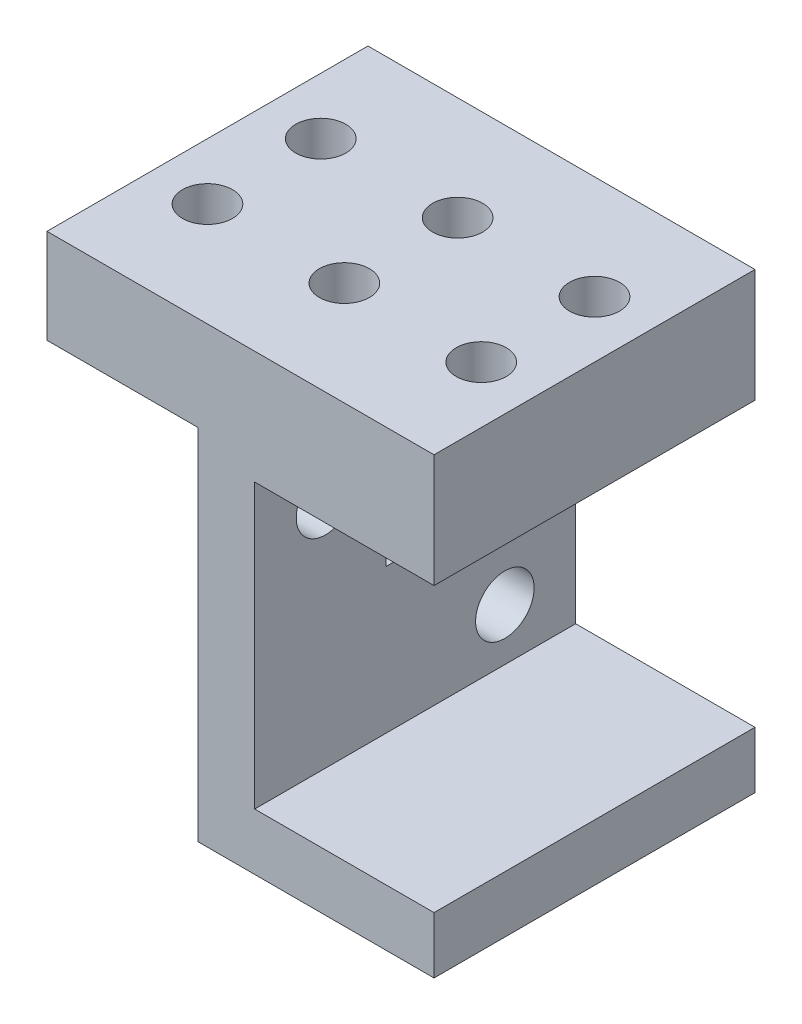
ISO-10303-21;
HEADER;
FILE_DESCRIPTION(('STEP AP214'),'2;1');
FILE_NAME('part.step','',(''),(''),'','','');
FILE_SCHEMA(('AUTOMOTIVE_DESIGN { 1 0 10303 214 1 1 1 1 }'));
ENDSEC;
DATA;
#1=APPLICATION_CONTEXT('core data for automotive mechanical design processes');
#2=APPLICATION_PROTOCOL_DEFINITION('international standard','automotive_design',2000,#1);
#3=PRODUCT_CONTEXT('',#1,'mechanical');
#4=PRODUCT('Part','Part','',(#3));
#5=PRODUCT_RELATED_PRODUCT_CATEGORY('part','',(#4));
#6=PRODUCT_DEFINITION_FORMATION('','',#4);
#7=PRODUCT_DEFINITION_CONTEXT('part definition',#1,'design');
#8=PRODUCT_DEFINITION('design','',#6,#7);
#9=PRODUCT_DEFINITION_SHAPE('','',#8);
#10=(LENGTH_UNIT() NAMED_UNIT(*) SI_UNIT(.MILLI.,.METRE.));
#11=(NAMED_UNIT(*) PLANE_ANGLE_UNIT() SI_UNIT($,.RADIAN.));
#12=(NAMED_UNIT(*) SI_UNIT($,.STERADIAN.) SOLID_ANGLE_UNIT());
#13=UNCERTAINTY_MEASURE_WITH_UNIT(LENGTH_MEASURE(1.E-05),#10,'distance_accuracy_value','');
#14=(GEOMETRIC_REPRESENTATION_CONTEXT(3) GLOBAL_UNCERTAINTY_ASSIGNED_CONTEXT((#13)) GLOBAL_UNIT_ASSIGNED_CONTEXT((#10,
#11,#12)) REPRESENTATION_CONTEXT('',''));
#15=CARTESIAN_POINT('',(0.,0.,0.));
#16=DIRECTION('',(0.,0.,1.));
#17=DIRECTION('',(1.,0.,0.));
#18=AXIS2_PLACEMENT_3D('',#15,#16,#17);
#19=CARTESIAN_POINT('',(12.5,0.,17.));
#20=DIRECTION('',(1.,0.,0.));
#21=DIRECTION('',(0.,0.,-1.));
#22=AXIS2_PLACEMENT_3D('',#19,#20,#21);
#23=PLANE('',#22);
#24=DIRECTION('',(0.,-1.,0.));
#25=VECTOR('',#24,1.);
#26=CARTESIAN_POINT('',(12.5,0.,0.));
#27=LINE('',#26,#25);
#28=CARTESIAN_POINT('',(12.5,24.,0.));
#29=VERTEX_POINT('',#28);
#30=CARTESIAN_POINT('',(12.5,18.,0.));
#31=VERTEX_POINT('',#30);
#32=EDGE_CURVE('E282',#29,#31,#27,.T.);
#33=ORIENTED_EDGE('',*,*,#32,.F.);
#34=DIRECTION('',(0.,0.,-1.));
#35=VECTOR('',#34,1.);
#36=CARTESIAN_POINT('',(12.5,24.,17.));
#37=LINE('',#36,#35);
#38=CARTESIAN_POINT('',(12.5,24.,17.));
#39=VERTEX_POINT('',#38);
#40=EDGE_CURVE('E50',#39,#29,#37,.T.);
#41=ORIENTED_EDGE('',*,*,#40,.F.);
#42=DIRECTION('',(0.,-1.,0.));
#43=VECTOR('',#42,1.);
#44=CARTESIAN_POINT('',(12.5,0.,17.));
#45=LINE('',#44,#43);
#46=CARTESIAN_POINT('',(12.5,18.,17.));
#47=VERTEX_POINT('',#46);
#48=EDGE_CURVE('E283',#39,#47,#45,.T.);
#49=ORIENTED_EDGE('',*,*,#48,.T.);
#50=DIRECTION('',(0.,0.,-1.));
#51=VECTOR('',#50,1.);
#52=CARTESIAN_POINT('',(12.5,18.,17.));
#53=LINE('',#52,#51);
#54=EDGE_CURVE('E322',#47,#31,#53,.T.);
#55=ORIENTED_EDGE('',*,*,#54,.T.);
#56=EDGE_LOOP('',(#33,#41,#49,#55));
#57=FACE_BOUND('',#56,.T.);
#58=ADVANCED_FACE('F42',(#57),#23,.T.);
#59=CARTESIAN_POINT('',(0.,24.,17.));
#60=DIRECTION('',(0.,1.,0.));
#61=DIRECTION('',(0.,0.,1.));
#62=AXIS2_PLACEMENT_3D('',#59,#60,#61);
#63=PLANE('',#62);
#64=CARTESIAN_POINT('',(-5.,24.,11.5));
#65=DIRECTION('',(0.,1.,0.));
#66=DIRECTION('',(0.,0.,1.));
#67=AXIS2_PLACEMENT_3D('',#64,#65,#66);
#68=CIRCLE('',#67,1.325);
#69=CARTESIAN_POINT('',(-5.,24.,12.825));
#70=VERTEX_POINT('',#69);
#71=EDGE_CURVE('E171',#70,#70,#68,.T.);
#72=ORIENTED_EDGE('',*,*,#71,.F.);
#73=EDGE_LOOP('',(#72));
#74=FACE_BOUND('',#73,.T.);
#75=CARTESIAN_POINT('',(-5.,24.,5.49999999999999));
#76=DIRECTION('',(0.,1.,0.));
#77=DIRECTION('',(0.,0.,1.));
#78=AXIS2_PLACEMENT_3D('',#75,#76,#77);
#79=CIRCLE('',#78,1.325);
#80=CARTESIAN_POINT('',(-5.,24.,6.82499999999999));
#81=VERTEX_POINT('',#80);
#82=EDGE_CURVE('E179',#81,#81,#79,.T.);
#83=ORIENTED_EDGE('',*,*,#82,.F.);
#84=EDGE_LOOP('',(#83));
#85=FACE_BOUND('',#84,.T.);
#86=CARTESIAN_POINT('',(2.25,24.,5.5));
#87=DIRECTION('',(0.,1.,0.));
#88=DIRECTION('',(0.,0.,1.));
#89=AXIS2_PLACEMENT_3D('',#86,#87,#88);
#90=CIRCLE('',#89,1.325);
#91=CARTESIAN_POINT('',(2.25,24.,6.825));
#92=VERTEX_POINT('',#91);
#93=EDGE_CURVE('E234',#92,#92,#90,.T.);
#94=ORIENTED_EDGE('',*,*,#93,.F.);
#95=EDGE_LOOP('',(#94));
#96=FACE_BOUND('',#95,.T.);
#97=CARTESIAN_POINT('',(2.25,24.,11.5));
#98=DIRECTION('',(0.,1.,0.));
#99=DIRECTION('',(0.,0.,1.));
#100=AXIS2_PLACEMENT_3D('',#97,#98,#99);
#101=CIRCLE('',#100,1.325);
#102=CARTESIAN_POINT('',(2.25,24.,12.825));
#103=VERTEX_POINT('',#102);
#104=EDGE_CURVE('E242',#103,#103,#101,.T.);
#105=ORIENTED_EDGE('',*,*,#104,.F.);
#106=EDGE_LOOP('',(#105));
#107=FACE_BOUND('',#106,.T.);
#108=CARTESIAN_POINT('',(9.5,24.,11.5));
#109=DIRECTION('',(0.,1.,0.));
#110=DIRECTION('',(0.,0.,1.));
#111=AXIS2_PLACEMENT_3D('',#108,#109,#110);
#112=CIRCLE('',#111,1.325);
#113=CARTESIAN_POINT('',(9.5,24.,12.825));
#114=VERTEX_POINT('',#113);
#115=EDGE_CURVE('E250',#114,#114,#112,.T.);
#116=ORIENTED_EDGE('',*,*,#115,.F.);
#117=EDGE_LOOP('',(#116));
#118=FACE_BOUND('',#117,.T.);
#119=CARTESIAN_POINT('',(9.5,24.,5.5));
#120=DIRECTION('',(0.,1.,0.));
#121=DIRECTION('',(0.,0.,1.));
#122=AXIS2_PLACEMENT_3D('',#119,#120,#121);
#123=CIRCLE('',#122,1.325);
#124=CARTESIAN_POINT('',(9.5,24.,6.825));
#125=VERTEX_POINT('',#124);
#126=EDGE_CURVE('E258',#125,#125,#123,.T.);
#127=ORIENTED_EDGE('',*,*,#126,.F.);
#128=EDGE_LOOP('',(#127));
#129=FACE_BOUND('',#128,.T.);
#130=DIRECTION('',(1.,0.,0.));
#131=VECTOR('',#130,1.);
#132=CARTESIAN_POINT('',(0.,24.,0.));
#133=LINE('',#132,#131);
#134=CARTESIAN_POINT('',(-8.,24.,0.));
#135=VERTEX_POINT('',#134);
#136=EDGE_CURVE('E300',#135,#29,#133,.T.);
#137=ORIENTED_EDGE('',*,*,#136,.F.);
#138=DIRECTION('',(0.,0.,1.));
#139=VECTOR('',#138,1.);
#140=CARTESIAN_POINT('',(-8.,24.,0.));
#141=LINE('',#140,#139);
#142=CARTESIAN_POINT('',(-8.,24.,17.));
#143=VERTEX_POINT('',#142);
#144=EDGE_CURVE('E191',#135,#143,#141,.T.);
#145=ORIENTED_EDGE('',*,*,#144,.T.);
#146=DIRECTION('',(1.,0.,0.));
#147=VECTOR('',#146,1.);
#148=CARTESIAN_POINT('',(0.,24.,17.));
#149=LINE('',#148,#147);
#150=EDGE_CURVE('E153',#143,#39,#149,.T.);
#151=ORIENTED_EDGE('',*,*,#150,.T.);
#152=ORIENTED_EDGE('',*,*,#40,.T.);
#153=EDGE_LOOP('',(#137,#145,#151,#152));
#154=FACE_BOUND('',#153,.T.);
#155=ADVANCED_FACE('F345',(#74,#85,#96,#107,#118,#129,#154),#63,.T.);
#156=CARTESIAN_POINT('',(0.,0.,17.));
#157=DIRECTION('',(-1.,0.,0.));
#158=DIRECTION('',(0.,-1.,0.));
#159=AXIS2_PLACEMENT_3D('',#156,#157,#158);
#160=PLANE('',#159);
#161=DIRECTION('',(0.,1.,0.));
#162=VECTOR('',#161,1.);
#163=CARTESIAN_POINT('',(0.,0.,17.));
#164=LINE('',#163,#162);
#165=CARTESIAN_POINT('',(0.,0.,17.));
#166=VERTEX_POINT('',#165);
#167=CARTESIAN_POINT('',(0.,19.,17.));
#168=VERTEX_POINT('',#167);
#169=EDGE_CURVE('E143',#166,#168,#164,.T.);
#170=ORIENTED_EDGE('',*,*,#169,.T.);
#171=DIRECTION('',(0.,0.,1.));
#172=VECTOR('',#171,1.);
#173=CARTESIAN_POINT('',(0.,19.,-8.99999999999999));
#174=LINE('',#173,#172);
#175=CARTESIAN_POINT('',(0.,19.,0.));
#176=VERTEX_POINT('',#175);
#177=EDGE_CURVE('E147',#176,#168,#174,.T.);
#178=ORIENTED_EDGE('',*,*,#177,.F.);
#179=DIRECTION('',(0.,1.,0.));
#180=VECTOR('',#179,1.);
#181=CARTESIAN_POINT('',(0.,0.,0.));
#182=LINE('',#181,#180);
#183=CARTESIAN_POINT('',(0.,0.,0.));
#184=VERTEX_POINT('',#183);
#185=EDGE_CURVE('E295',#184,#176,#182,.T.);
#186=ORIENTED_EDGE('',*,*,#185,.F.);
#187=DIRECTION('',(0.,0.,-1.));
#188=VECTOR('',#187,1.);
#189=CARTESIAN_POINT('',(0.,0.,17.));
#190=LINE('',#189,#188);
#191=EDGE_CURVE('E148',#166,#184,#190,.T.);
#192=ORIENTED_EDGE('',*,*,#191,.F.);
#193=EDGE_LOOP('',(#170,#178,#186,#192));
#194=FACE_BOUND('',#193,.T.);
#195=DIRECTION('',(0.,1.,0.));
#196=VECTOR('',#195,1.);
#197=CARTESIAN_POINT('',(0.,0.,10.05));
#198=LINE('',#197,#196);
#199=CARTESIAN_POINT('',(0.,10.65,10.05));
#200=VERTEX_POINT('',#199);
#201=CARTESIAN_POINT('',(0.,17.15,10.05));
#202=VERTEX_POINT('',#201);
#203=EDGE_CURVE('E231',#200,#202,#198,.T.);
#204=ORIENTED_EDGE('',*,*,#203,.F.);
#205=DIRECTION('',(0.,0.,1.));
#206=VECTOR('',#205,1.);
#207=CARTESIAN_POINT('',(0.,10.65,17.));
#208=LINE('',#207,#206);
#209=CARTESIAN_POINT('',(0.,10.65,0.85));
#210=VERTEX_POINT('',#209);
#211=EDGE_CURVE('E214',#210,#200,#208,.T.);
#212=ORIENTED_EDGE('',*,*,#211,.F.);
#213=DIRECTION('',(0.,-1.,0.));
#214=VECTOR('',#213,1.);
#215=CARTESIAN_POINT('',(0.,0.,0.849999999999997));
#216=LINE('',#215,#214);
#217=CARTESIAN_POINT('',(0.,17.15,0.85));
#218=VERTEX_POINT('',#217);
#219=EDGE_CURVE('E225',#218,#210,#216,.T.);
#220=ORIENTED_EDGE('',*,*,#219,.F.);
#221=DIRECTION('',(0.,0.,-1.));
#222=VECTOR('',#221,1.);
#223=CARTESIAN_POINT('',(0.,17.15,17.));
#224=LINE('',#223,#222);
#225=EDGE_CURVE('E228',#202,#218,#224,.T.);
#226=ORIENTED_EDGE('',*,*,#225,.F.);
#227=EDGE_LOOP('',(#204,#212,#220,#226));
#228=FACE_BOUND('',#227,.T.);
#229=CARTESIAN_POINT('',(0.,15.25,13.25));
#230=DIRECTION('',(1.,0.,0.));
#231=DIRECTION('',(0.,0.,-1.));
#232=AXIS2_PLACEMENT_3D('',#229,#230,#231);
#233=CIRCLE('',#232,1.55);
#234=CARTESIAN_POINT('',(0.,15.25,11.7));
#235=VERTEX_POINT('',#234);
#236=EDGE_CURVE('E270',#235,#235,#233,.T.);
#237=ORIENTED_EDGE('',*,*,#236,.T.);
#238=EDGE_LOOP('',(#237));
#239=FACE_BOUND('',#238,.T.);
#240=CARTESIAN_POINT('',(0.,5.75,3.75));
#241=DIRECTION('',(1.,0.,0.));
#242=DIRECTION('',(0.,0.,-1.));
#243=AXIS2_PLACEMENT_3D('',#240,#241,#242);
#244=CIRCLE('',#243,1.55);
#245=CARTESIAN_POINT('',(0.,5.75,2.2));
#246=VERTEX_POINT('',#245);
#247=EDGE_CURVE('E278',#246,#246,#244,.T.);
#248=ORIENTED_EDGE('',*,*,#247,.T.);
#249=EDGE_LOOP('',(#248));
#250=FACE_BOUND('',#249,.T.);
#251=ADVANCED_FACE('F144',(#194,#228,#239,#250),#160,.T.);
#252=CARTESIAN_POINT('',(0.,0.,17.));
#253=DIRECTION('',(0.,1.,0.));
#254=DIRECTION('',(0.,0.,1.));
#255=AXIS2_PLACEMENT_3D('',#252,#253,#254);
#256=PLANE('',#255);
#257=DIRECTION('',(1.,0.,0.));
#258=VECTOR('',#257,1.);
#259=CARTESIAN_POINT('',(0.,0.,0.));
#260=LINE('',#259,#258);
#261=CARTESIAN_POINT('',(12.5,0.,0.));
#262=VERTEX_POINT('',#261);
#263=EDGE_CURVE('E299',#184,#262,#260,.T.);
#264=ORIENTED_EDGE('',*,*,#263,.T.);
#265=DIRECTION('',(0.,0.,-1.));
#266=VECTOR('',#265,1.);
#267=CARTESIAN_POINT('',(12.5,0.,17.));
#268=LINE('',#267,#266);
#269=CARTESIAN_POINT('',(12.5,0.,17.));
#270=VERTEX_POINT('',#269);
#271=EDGE_CURVE('E336',#270,#262,#268,.T.);
#272=ORIENTED_EDGE('',*,*,#271,.F.);
#273=DIRECTION('',(1.,0.,0.));
#274=VECTOR('',#273,1.);
#275=CARTESIAN_POINT('',(0.,0.,17.));
#276=LINE('',#275,#274);
#277=EDGE_CURVE('E152',#166,#270,#276,.T.);
#278=ORIENTED_EDGE('',*,*,#277,.F.);
#279=ORIENTED_EDGE('',*,*,#191,.T.);
#280=EDGE_LOOP('',(#264,#272,#278,#279));
#281=FACE_BOUND('',#280,.T.);
#282=ADVANCED_FACE('F382',(#281),#256,.F.);
#283=CARTESIAN_POINT('',(12.5,0.,17.));
#284=DIRECTION('',(-1.,0.,0.));
#285=DIRECTION('',(0.,0.,1.));
#286=AXIS2_PLACEMENT_3D('',#283,#284,#285);
#287=PLANE('',#286);
#288=DIRECTION('',(0.,1.,0.));
#289=VECTOR('',#288,1.);
#290=CARTESIAN_POINT('',(12.5,0.,0.));
#291=LINE('',#290,#289);
#292=CARTESIAN_POINT('',(12.5,3.,0.));
#293=VERTEX_POINT('',#292);
#294=EDGE_CURVE('E308',#262,#293,#291,.T.);
#295=ORIENTED_EDGE('',*,*,#294,.T.);
#296=DIRECTION('',(0.,0.,-1.));
#297=VECTOR('',#296,1.);
#298=CARTESIAN_POINT('',(12.5,3.,17.));
#299=LINE('',#298,#297);
#300=CARTESIAN_POINT('',(12.5,3.,17.));
#301=VERTEX_POINT('',#300);
#302=EDGE_CURVE('E333',#301,#293,#299,.T.);
#303=ORIENTED_EDGE('',*,*,#302,.F.);
#304=DIRECTION('',(0.,1.,0.));
#305=VECTOR('',#304,1.);
#306=CARTESIAN_POINT('',(12.5,0.,17.));
#307=LINE('',#306,#305);
#308=EDGE_CURVE('E490',#270,#301,#307,.T.);
#309=ORIENTED_EDGE('',*,*,#308,.F.);
#310=ORIENTED_EDGE('',*,*,#271,.T.);
#311=EDGE_LOOP('',(#295,#303,#309,#310));
#312=FACE_BOUND('',#311,.T.);
#313=ADVANCED_FACE('F389',(#312),#287,.F.);
#314=CARTESIAN_POINT('',(0.,3.,17.));
#315=DIRECTION('',(0.,1.,0.));
#316=DIRECTION('',(0.,0.,1.));
#317=AXIS2_PLACEMENT_3D('',#314,#315,#316);
#318=PLANE('',#317);
#319=DIRECTION('',(1.,0.,0.));
#320=VECTOR('',#319,1.);
#321=CARTESIAN_POINT('',(0.,3.,0.));
#322=LINE('',#321,#320);
#323=CARTESIAN_POINT('',(3.,3.,0.));
#324=VERTEX_POINT('',#323);
#325=EDGE_CURVE('E312',#324,#293,#322,.T.);
#326=ORIENTED_EDGE('',*,*,#325,.F.);
#327=DIRECTION('',(0.,0.,-1.));
#328=VECTOR('',#327,1.);
#329=CARTESIAN_POINT('',(3.,3.,17.));
#330=LINE('',#329,#328);
#331=CARTESIAN_POINT('',(3.,3.,17.));
#332=VERTEX_POINT('',#331);
#333=EDGE_CURVE('E330',#332,#324,#330,.T.);
#334=ORIENTED_EDGE('',*,*,#333,.F.);
#335=DIRECTION('',(1.,0.,0.));
#336=VECTOR('',#335,1.);
#337=CARTESIAN_POINT('',(0.,3.,17.));
#338=LINE('',#337,#336);
#339=EDGE_CURVE('E485',#332,#301,#338,.T.);
#340=ORIENTED_EDGE('',*,*,#339,.T.);
#341=ORIENTED_EDGE('',*,*,#302,.T.);
#342=EDGE_LOOP('',(#326,#334,#340,#341));
#343=FACE_BOUND('',#342,.T.);
#344=ADVANCED_FACE('F392',(#343),#318,.T.);
#345=CARTESIAN_POINT('',(3.,0.,17.));
#346=DIRECTION('',(-1.,0.,0.));
#347=DIRECTION('',(0.,0.,1.));
#348=AXIS2_PLACEMENT_3D('',#345,#346,#347);
#349=PLANE('',#348);
#350=DIRECTION('',(0.,0.,-1.));
#351=VECTOR('',#350,1.);
#352=CARTESIAN_POINT('',(3.,10.65,10.05));
#353=LINE('',#352,#351);
#354=CARTESIAN_POINT('',(3.,10.65,10.05));
#355=VERTEX_POINT('',#354);
#356=CARTESIAN_POINT('',(3.,10.65,0.849999999999999));
#357=VERTEX_POINT('',#356);
#358=EDGE_CURVE('E199',#355,#357,#353,.T.);
#359=ORIENTED_EDGE('',*,*,#358,.F.);
#360=DIRECTION('',(0.,-1.,0.));
#361=VECTOR('',#360,1.);
#362=CARTESIAN_POINT('',(3.,17.15,10.05));
#363=LINE('',#362,#361);
#364=CARTESIAN_POINT('',(3.,17.15,10.05));
#365=VERTEX_POINT('',#364);
#366=EDGE_CURVE('E196',#365,#355,#363,.T.);
#367=ORIENTED_EDGE('',*,*,#366,.F.);
#368=DIRECTION('',(0.,0.,1.));
#369=VECTOR('',#368,1.);
#370=CARTESIAN_POINT('',(3.,17.15,10.05));
#371=LINE('',#370,#369);
#372=CARTESIAN_POINT('',(3.,17.15,0.85));
#373=VERTEX_POINT('',#372);
#374=EDGE_CURVE('E206',#373,#365,#371,.T.);
#375=ORIENTED_EDGE('',*,*,#374,.F.);
#376=DIRECTION('',(0.,1.,0.));
#377=VECTOR('',#376,1.);
#378=CARTESIAN_POINT('',(3.,17.15,0.85));
#379=LINE('',#378,#377);
#380=EDGE_CURVE('E202',#357,#373,#379,.T.);
#381=ORIENTED_EDGE('',*,*,#380,.F.);
#382=EDGE_LOOP('',(#359,#367,#375,#381));
#383=FACE_BOUND('',#382,.T.);
#384=CARTESIAN_POINT('',(3.,15.25,13.25));
#385=DIRECTION('',(1.,0.,0.));
#386=DIRECTION('',(0.,0.,-1.));
#387=AXIS2_PLACEMENT_3D('',#384,#385,#386);
#388=CIRCLE('',#387,1.55);
#389=CARTESIAN_POINT('',(3.,15.25,11.7));
#390=VERTEX_POINT('',#389);
#391=EDGE_CURVE('E266',#390,#390,#388,.T.);
#392=ORIENTED_EDGE('',*,*,#391,.F.);
#393=EDGE_LOOP('',(#392));
#394=FACE_BOUND('',#393,.T.);
#395=CARTESIAN_POINT('',(3.,5.75,3.75));
#396=DIRECTION('',(1.,0.,0.));
#397=DIRECTION('',(0.,0.,-1.));
#398=AXIS2_PLACEMENT_3D('',#395,#396,#397);
#399=CIRCLE('',#398,1.55);
#400=CARTESIAN_POINT('',(3.,5.75,2.2));
#401=VERTEX_POINT('',#400);
#402=EDGE_CURVE('E274',#401,#401,#399,.T.);
#403=ORIENTED_EDGE('',*,*,#402,.F.);
#404=EDGE_LOOP('',(#403));
#405=FACE_BOUND('',#404,.T.);
#406=DIRECTION('',(0.,1.,0.));
#407=VECTOR('',#406,1.);
#408=CARTESIAN_POINT('',(3.,0.,0.));
#409=LINE('',#408,#407);
#410=CARTESIAN_POINT('',(3.,18.,0.));
#411=VERTEX_POINT('',#410);
#412=EDGE_CURVE('E316',#324,#411,#409,.T.);
#413=ORIENTED_EDGE('',*,*,#412,.T.);
#414=DIRECTION('',(0.,0.,-1.));
#415=VECTOR('',#414,1.);
#416=CARTESIAN_POINT('',(3.,18.,17.));
#417=LINE('',#416,#415);
#418=CARTESIAN_POINT('',(3.,18.,17.));
#419=VERTEX_POINT('',#418);
#420=EDGE_CURVE('E325',#419,#411,#417,.T.);
#421=ORIENTED_EDGE('',*,*,#420,.F.);
#422=DIRECTION('',(0.,1.,0.));
#423=VECTOR('',#422,1.);
#424=CARTESIAN_POINT('',(3.,0.,17.));
#425=LINE('',#424,#423);
#426=EDGE_CURVE('E482',#332,#419,#425,.T.);
#427=ORIENTED_EDGE('',*,*,#426,.F.);
#428=ORIENTED_EDGE('',*,*,#333,.T.);
#429=EDGE_LOOP('',(#413,#421,#427,#428));
#430=FACE_BOUND('',#429,.T.);
#431=ADVANCED_FACE('F396',(#383,#394,#405,#430),#349,.F.);
#432=CARTESIAN_POINT('',(0.,18.,17.));
#433=DIRECTION('',(0.,1.,0.));
#434=DIRECTION('',(0.,0.,1.));
#435=AXIS2_PLACEMENT_3D('',#432,#433,#434);
#436=PLANE('',#435);
#437=DIRECTION('',(1.,0.,0.));
#438=VECTOR('',#437,1.);
#439=CARTESIAN_POINT('',(0.,18.,0.));
#440=LINE('',#439,#438);
#441=EDGE_CURVE('E287',#411,#31,#440,.T.);
#442=ORIENTED_EDGE('',*,*,#441,.T.);
#443=ORIENTED_EDGE('',*,*,#54,.F.);
#444=DIRECTION('',(1.,0.,0.));
#445=VECTOR('',#444,1.);
#446=CARTESIAN_POINT('',(0.,18.,17.));
#447=LINE('',#446,#445);
#448=EDGE_CURVE('E326',#419,#47,#447,.T.);
#449=ORIENTED_EDGE('',*,*,#448,.F.);
#450=ORIENTED_EDGE('',*,*,#420,.T.);
#451=EDGE_LOOP('',(#442,#443,#449,#450));
#452=FACE_BOUND('',#451,.T.);
#453=ADVANCED_FACE('F400',(#452),#436,.F.);
#454=CARTESIAN_POINT('',(0.,0.,17.));
#455=DIRECTION('',(0.,0.,1.));
#456=DIRECTION('',(1.,0.,0.));
#457=AXIS2_PLACEMENT_3D('',#454,#455,#456);
#458=PLANE('',#457);
#459=DIRECTION('',(-1.,0.,0.));
#460=VECTOR('',#459,1.);
#461=CARTESIAN_POINT('',(-8.,19.,17.));
#462=LINE('',#461,#460);
#463=CARTESIAN_POINT('',(-8.,19.,17.));
#464=VERTEX_POINT('',#463);
#465=EDGE_CURVE('E56',#168,#464,#462,.T.);
#466=ORIENTED_EDGE('',*,*,#465,.F.);
#467=ORIENTED_EDGE('',*,*,#169,.F.);
#468=ORIENTED_EDGE('',*,*,#277,.T.);
#469=ORIENTED_EDGE('',*,*,#308,.T.);
#470=ORIENTED_EDGE('',*,*,#339,.F.);
#471=ORIENTED_EDGE('',*,*,#426,.T.);
#472=ORIENTED_EDGE('',*,*,#448,.T.);
#473=ORIENTED_EDGE('',*,*,#48,.F.);
#474=ORIENTED_EDGE('',*,*,#150,.F.);
#475=DIRECTION('',(0.,-1.,0.));
#476=VECTOR('',#475,1.);
#477=CARTESIAN_POINT('',(-8.,24.,17.));
#478=LINE('',#477,#476);
#479=EDGE_CURVE('E163',#143,#464,#478,.T.);
#480=ORIENTED_EDGE('',*,*,#479,.T.);
#481=EDGE_LOOP('',(#466,#467,#468,#469,#470,#471,#472,#473,#474,#480));
#482=FACE_BOUND('',#481,.T.);
#483=ADVANCED_FACE('F161',(#482),#458,.T.);
#484=CARTESIAN_POINT('',(0.,0.,0.));
#485=DIRECTION('',(0.,0.,1.));
#486=DIRECTION('',(1.,0.,0.));
#487=AXIS2_PLACEMENT_3D('',#484,#485,#486);
#488=PLANE('',#487);
#489=ORIENTED_EDGE('',*,*,#185,.T.);
#490=DIRECTION('',(-1.,0.,0.));
#491=VECTOR('',#490,1.);
#492=CARTESIAN_POINT('',(0.,19.,0.));
#493=LINE('',#492,#491);
#494=CARTESIAN_POINT('',(-8.,19.,0.));
#495=VERTEX_POINT('',#494);
#496=EDGE_CURVE('E157',#176,#495,#493,.T.);
#497=ORIENTED_EDGE('',*,*,#496,.T.);
#498=DIRECTION('',(0.,-1.,0.));
#499=VECTOR('',#498,1.);
#500=CARTESIAN_POINT('',(-8.,24.,0.));
#501=LINE('',#500,#499);
#502=EDGE_CURVE('E187',#135,#495,#501,.T.);
#503=ORIENTED_EDGE('',*,*,#502,.F.);
#504=ORIENTED_EDGE('',*,*,#136,.T.);
#505=ORIENTED_EDGE('',*,*,#32,.T.);
#506=ORIENTED_EDGE('',*,*,#441,.F.);
#507=ORIENTED_EDGE('',*,*,#412,.F.);
#508=ORIENTED_EDGE('',*,*,#325,.T.);
#509=ORIENTED_EDGE('',*,*,#294,.F.);
#510=ORIENTED_EDGE('',*,*,#263,.F.);
#511=EDGE_LOOP('',(#489,#497,#503,#504,#505,#506,#507,#508,#509,#510));
#512=FACE_BOUND('',#511,.T.);
#513=ADVANCED_FACE('F356',(#512),#488,.F.);
#514=CARTESIAN_POINT('',(3.,5.75,3.75));
#515=DIRECTION('',(1.,0.,0.));
#516=DIRECTION('',(0.,0.,-1.));
#517=AXIS2_PLACEMENT_3D('',#514,#515,#516);
#518=CYLINDRICAL_SURFACE('',#517,1.55);
#519=ORIENTED_EDGE('',*,*,#247,.F.);
#520=EDGE_LOOP('',(#519));
#521=FACE_BOUND('',#520,.T.);
#522=ORIENTED_EDGE('',*,*,#402,.T.);
#523=EDGE_LOOP('',(#522));
#524=FACE_BOUND('',#523,.T.);
#525=ADVANCED_FACE('F407',(#521,#524),#518,.F.);
#526=CARTESIAN_POINT('',(3.,15.25,13.25));
#527=DIRECTION('',(1.,0.,0.));
#528=DIRECTION('',(0.,0.,-1.));
#529=AXIS2_PLACEMENT_3D('',#526,#527,#528);
#530=CYLINDRICAL_SURFACE('',#529,1.55);
#531=ORIENTED_EDGE('',*,*,#236,.F.);
#532=EDGE_LOOP('',(#531));
#533=FACE_BOUND('',#532,.T.);
#534=ORIENTED_EDGE('',*,*,#391,.T.);
#535=EDGE_LOOP('',(#534));
#536=FACE_BOUND('',#535,.T.);
#537=ADVANCED_FACE('F412',(#533,#536),#530,.F.);
#538=CARTESIAN_POINT('',(9.5,19.7,5.5));
#539=DIRECTION('',(0.,-1.,0.));
#540=DIRECTION('',(0.,0.,-1.));
#541=AXIS2_PLACEMENT_3D('',#538,#539,#540);
#542=PLANE('',#541);
#543=CARTESIAN_POINT('',(9.5,19.7,5.5));
#544=DIRECTION('',(0.,1.,0.));
#545=DIRECTION('',(0.,0.,1.));
#546=AXIS2_PLACEMENT_3D('',#543,#544,#545);
#547=CIRCLE('',#546,1.325);
#548=CARTESIAN_POINT('',(9.5,19.7,6.825));
#549=VERTEX_POINT('',#548);
#550=EDGE_CURVE('E262',#549,#549,#547,.T.);
#551=ORIENTED_EDGE('',*,*,#550,.T.);
#552=EDGE_LOOP('',(#551));
#553=FACE_BOUND('',#552,.T.);
#554=ADVANCED_FACE('F416',(#553),#542,.F.);
#555=CARTESIAN_POINT('',(9.5,24.,5.5));
#556=DIRECTION('',(0.,1.,0.));
#557=DIRECTION('',(0.,0.,1.));
#558=AXIS2_PLACEMENT_3D('',#555,#556,#557);
#559=CYLINDRICAL_SURFACE('',#558,1.325);
#560=ORIENTED_EDGE('',*,*,#550,.F.);
#561=EDGE_LOOP('',(#560));
#562=FACE_BOUND('',#561,.T.);
#563=ORIENTED_EDGE('',*,*,#126,.T.);
#564=EDGE_LOOP('',(#563));
#565=FACE_BOUND('',#564,.T.);
#566=ADVANCED_FACE('F420',(#562,#565),#559,.F.);
#567=CARTESIAN_POINT('',(9.5,19.7,11.5));
#568=DIRECTION('',(0.,-1.,0.));
#569=DIRECTION('',(0.,0.,-1.));
#570=AXIS2_PLACEMENT_3D('',#567,#568,#569);
#571=PLANE('',#570);
#572=CARTESIAN_POINT('',(9.5,19.7,11.5));
#573=DIRECTION('',(0.,1.,0.));
#574=DIRECTION('',(0.,0.,1.));
#575=AXIS2_PLACEMENT_3D('',#572,#573,#574);
#576=CIRCLE('',#575,1.325);
#577=CARTESIAN_POINT('',(9.5,19.7,12.825));
#578=VERTEX_POINT('',#577);
#579=EDGE_CURVE('E254',#578,#578,#576,.T.);
#580=ORIENTED_EDGE('',*,*,#579,.T.);
#581=EDGE_LOOP('',(#580));
#582=FACE_BOUND('',#581,.T.);
#583=ADVANCED_FACE('F424',(#582),#571,.F.);
#584=CARTESIAN_POINT('',(9.5,24.,11.5));
#585=DIRECTION('',(0.,1.,0.));
#586=DIRECTION('',(0.,0.,1.));
#587=AXIS2_PLACEMENT_3D('',#584,#585,#586);
#588=CYLINDRICAL_SURFACE('',#587,1.325);
#589=ORIENTED_EDGE('',*,*,#579,.F.);
#590=EDGE_LOOP('',(#589));
#591=FACE_BOUND('',#590,.T.);
#592=ORIENTED_EDGE('',*,*,#115,.T.);
#593=EDGE_LOOP('',(#592));
#594=FACE_BOUND('',#593,.T.);
#595=ADVANCED_FACE('F428',(#591,#594),#588,.F.);
#596=CARTESIAN_POINT('',(2.25,19.7,11.5));
#597=DIRECTION('',(0.,-1.,0.));
#598=DIRECTION('',(0.,0.,-1.));
#599=AXIS2_PLACEMENT_3D('',#596,#597,#598);
#600=PLANE('',#599);
#601=CARTESIAN_POINT('',(2.25,19.7,11.5));
#602=DIRECTION('',(0.,1.,0.));
#603=DIRECTION('',(0.,0.,1.));
#604=AXIS2_PLACEMENT_3D('',#601,#602,#603);
#605=CIRCLE('',#604,1.325);
#606=CARTESIAN_POINT('',(2.25,19.7,12.825));
#607=VERTEX_POINT('',#606);
#608=EDGE_CURVE('E246',#607,#607,#605,.T.);
#609=ORIENTED_EDGE('',*,*,#608,.T.);
#610=EDGE_LOOP('',(#609));
#611=FACE_BOUND('',#610,.T.);
#612=ADVANCED_FACE('F432',(#611),#600,.F.);
#613=CARTESIAN_POINT('',(2.25,24.,11.5));
#614=DIRECTION('',(0.,1.,0.));
#615=DIRECTION('',(0.,0.,1.));
#616=AXIS2_PLACEMENT_3D('',#613,#614,#615);
#617=CYLINDRICAL_SURFACE('',#616,1.325);
#618=ORIENTED_EDGE('',*,*,#608,.F.);
#619=EDGE_LOOP('',(#618));
#620=FACE_BOUND('',#619,.T.);
#621=ORIENTED_EDGE('',*,*,#104,.T.);
#622=EDGE_LOOP('',(#621));
#623=FACE_BOUND('',#622,.T.);
#624=ADVANCED_FACE('F436',(#620,#623),#617,.F.);
#625=CARTESIAN_POINT('',(2.25,19.7,5.5));
#626=DIRECTION('',(0.,-1.,0.));
#627=DIRECTION('',(0.,0.,-1.));
#628=AXIS2_PLACEMENT_3D('',#625,#626,#627);
#629=PLANE('',#628);
#630=CARTESIAN_POINT('',(2.25,19.7,5.5));
#631=DIRECTION('',(0.,1.,0.));
#632=DIRECTION('',(0.,0.,1.));
#633=AXIS2_PLACEMENT_3D('',#630,#631,#632);
#634=CIRCLE('',#633,1.325);
#635=CARTESIAN_POINT('',(2.25,19.7,6.825));
#636=VERTEX_POINT('',#635);
#637=EDGE_CURVE('E238',#636,#636,#634,.T.);
#638=ORIENTED_EDGE('',*,*,#637,.T.);
#639=EDGE_LOOP('',(#638));
#640=FACE_BOUND('',#639,.T.);
#641=ADVANCED_FACE('F440',(#640),#629,.F.);
#642=CARTESIAN_POINT('',(2.25,24.,5.5));
#643=DIRECTION('',(0.,1.,0.));
#644=DIRECTION('',(0.,0.,1.));
#645=AXIS2_PLACEMENT_3D('',#642,#643,#644);
#646=CYLINDRICAL_SURFACE('',#645,1.325);
#647=ORIENTED_EDGE('',*,*,#637,.F.);
#648=EDGE_LOOP('',(#647));
#649=FACE_BOUND('',#648,.T.);
#650=ORIENTED_EDGE('',*,*,#93,.T.);
#651=EDGE_LOOP('',(#650));
#652=FACE_BOUND('',#651,.T.);
#653=ADVANCED_FACE('F444',(#649,#652),#646,.F.);
#654=CARTESIAN_POINT('',(-7.,17.15,10.05));
#655=DIRECTION('',(0.,0.,1.));
#656=DIRECTION('',(1.,0.,0.));
#657=AXIS2_PLACEMENT_3D('',#654,#655,#656);
#658=PLANE('',#657);
#659=ORIENTED_EDGE('',*,*,#203,.T.);
#660=DIRECTION('',(1.,0.,0.));
#661=VECTOR('',#660,1.);
#662=CARTESIAN_POINT('',(-7.,17.15,10.05));
#663=LINE('',#662,#661);
#664=EDGE_CURVE('E211',#202,#365,#663,.T.);
#665=ORIENTED_EDGE('',*,*,#664,.T.);
#666=ORIENTED_EDGE('',*,*,#366,.T.);
#667=DIRECTION('',(1.,0.,0.));
#668=VECTOR('',#667,1.);
#669=CARTESIAN_POINT('',(-7.,10.65,10.05));
#670=LINE('',#669,#668);
#671=EDGE_CURVE('E210',#200,#355,#670,.T.);
#672=ORIENTED_EDGE('',*,*,#671,.F.);
#673=EDGE_LOOP('',(#659,#665,#666,#672));
#674=FACE_BOUND('',#673,.T.);
#675=ADVANCED_FACE('F448',(#674),#658,.F.);
#676=CARTESIAN_POINT('',(-7.,17.15,10.05));
#677=DIRECTION('',(0.,1.,0.));
#678=DIRECTION('',(0.,0.,1.));
#679=AXIS2_PLACEMENT_3D('',#676,#677,#678);
#680=PLANE('',#679);
#681=ORIENTED_EDGE('',*,*,#225,.T.);
#682=DIRECTION('',(1.,0.,0.));
#683=VECTOR('',#682,1.);
#684=CARTESIAN_POINT('',(-7.,17.15,0.85));
#685=LINE('',#684,#683);
#686=EDGE_CURVE('E215',#218,#373,#685,.T.);
#687=ORIENTED_EDGE('',*,*,#686,.T.);
#688=ORIENTED_EDGE('',*,*,#374,.T.);
#689=ORIENTED_EDGE('',*,*,#664,.F.);
#690=EDGE_LOOP('',(#681,#687,#688,#689));
#691=FACE_BOUND('',#690,.T.);
#692=ADVANCED_FACE('F451',(#691),#680,.F.);
#693=CARTESIAN_POINT('',(-7.,17.15,0.85));
#694=DIRECTION('',(0.,0.,-1.));
#695=DIRECTION('',(0.,1.,0.));
#696=AXIS2_PLACEMENT_3D('',#693,#694,#695);
#697=PLANE('',#696);
#698=ORIENTED_EDGE('',*,*,#219,.T.);
#699=DIRECTION('',(1.,0.,0.));
#700=VECTOR('',#699,1.);
#701=CARTESIAN_POINT('',(-7.,10.65,0.849999999999999));
#702=LINE('',#701,#700);
#703=EDGE_CURVE('E64',#210,#357,#702,.T.);
#704=ORIENTED_EDGE('',*,*,#703,.T.);
#705=ORIENTED_EDGE('',*,*,#380,.T.);
#706=ORIENTED_EDGE('',*,*,#686,.F.);
#707=EDGE_LOOP('',(#698,#704,#705,#706));
#708=FACE_BOUND('',#707,.T.);
#709=ADVANCED_FACE('F371',(#708),#697,.F.);
#710=CARTESIAN_POINT('',(-7.,10.65,10.05));
#711=DIRECTION('',(0.,-1.,0.));
#712=DIRECTION('',(0.,0.,-1.));
#713=AXIS2_PLACEMENT_3D('',#710,#711,#712);
#714=PLANE('',#713);
#715=ORIENTED_EDGE('',*,*,#211,.T.);
#716=ORIENTED_EDGE('',*,*,#671,.T.);
#717=ORIENTED_EDGE('',*,*,#358,.T.);
#718=ORIENTED_EDGE('',*,*,#703,.F.);
#719=EDGE_LOOP('',(#715,#716,#717,#718));
#720=FACE_BOUND('',#719,.T.);
#721=ADVANCED_FACE('F362',(#720),#714,.F.);
#722=CARTESIAN_POINT('',(-8.,24.,0.));
#723=DIRECTION('',(-1.,0.,0.));
#724=DIRECTION('',(0.,-1.,0.));
#725=AXIS2_PLACEMENT_3D('',#722,#723,#724);
#726=PLANE('',#725);
#727=DIRECTION('',(0.,0.,-1.));
#728=VECTOR('',#727,1.);
#729=CARTESIAN_POINT('',(-8.,19.,0.));
#730=LINE('',#729,#728);
#731=EDGE_CURVE('E11',#464,#495,#730,.T.);
#732=ORIENTED_EDGE('',*,*,#731,.F.);
#733=ORIENTED_EDGE('',*,*,#479,.F.);
#734=ORIENTED_EDGE('',*,*,#144,.F.);
#735=ORIENTED_EDGE('',*,*,#502,.T.);
#736=EDGE_LOOP('',(#732,#733,#734,#735));
#737=FACE_BOUND('',#736,.T.);
#738=ADVANCED_FACE('F359',(#737),#726,.T.);
#739=CARTESIAN_POINT('',(-5.,19.7,5.49999999999999));
#740=DIRECTION('',(0.,-1.,0.));
#741=DIRECTION('',(0.,0.,-1.));
#742=AXIS2_PLACEMENT_3D('',#739,#740,#741);
#743=PLANE('',#742);
#744=CARTESIAN_POINT('',(-5.,19.7,5.49999999999999));
#745=DIRECTION('',(0.,1.,0.));
#746=DIRECTION('',(0.,0.,1.));
#747=AXIS2_PLACEMENT_3D('',#744,#745,#746);
#748=CIRCLE('',#747,1.325);
#749=CARTESIAN_POINT('',(-5.,19.7,6.82499999999999));
#750=VERTEX_POINT('',#749);
#751=EDGE_CURVE('E183',#750,#750,#748,.T.);
#752=ORIENTED_EDGE('',*,*,#751,.T.);
#753=EDGE_LOOP('',(#752));
#754=FACE_BOUND('',#753,.T.);
#755=ADVANCED_FACE('F361',(#754),#743,.F.);
#756=CARTESIAN_POINT('',(-5.,24.,5.49999999999999));
#757=DIRECTION('',(0.,1.,0.));
#758=DIRECTION('',(0.,0.,1.));
#759=AXIS2_PLACEMENT_3D('',#756,#757,#758);
#760=CYLINDRICAL_SURFACE('',#759,1.325);
#761=ORIENTED_EDGE('',*,*,#751,.F.);
#762=EDGE_LOOP('',(#761));
#763=FACE_BOUND('',#762,.T.);
#764=ORIENTED_EDGE('',*,*,#82,.T.);
#765=EDGE_LOOP('',(#764));
#766=FACE_BOUND('',#765,.T.);
#767=ADVANCED_FACE('F368',(#763,#766),#760,.F.);
#768=CARTESIAN_POINT('',(-5.00000000000001,19.7,11.5));
#769=DIRECTION('',(0.,-1.,0.));
#770=DIRECTION('',(0.,0.,-1.));
#771=AXIS2_PLACEMENT_3D('',#768,#769,#770);
#772=PLANE('',#771);
#773=CARTESIAN_POINT('',(-5.,19.7,11.5));
#774=DIRECTION('',(0.,1.,0.));
#775=DIRECTION('',(0.,0.,1.));
#776=AXIS2_PLACEMENT_3D('',#773,#774,#775);
#777=CIRCLE('',#776,1.325);
#778=CARTESIAN_POINT('',(-5.,19.7,12.825));
#779=VERTEX_POINT('',#778);
#780=EDGE_CURVE('E175',#779,#779,#777,.T.);
#781=ORIENTED_EDGE('',*,*,#780,.T.);
#782=EDGE_LOOP('',(#781));
#783=FACE_BOUND('',#782,.T.);
#784=ADVANCED_FACE('F529',(#783),#772,.F.);
#785=CARTESIAN_POINT('',(-5.,24.,11.5));
#786=DIRECTION('',(0.,1.,0.));
#787=DIRECTION('',(0.,0.,1.));
#788=AXIS2_PLACEMENT_3D('',#785,#786,#787);
#789=CYLINDRICAL_SURFACE('',#788,1.325);
#790=ORIENTED_EDGE('',*,*,#780,.F.);
#791=EDGE_LOOP('',(#790));
#792=FACE_BOUND('',#791,.T.);
#793=ORIENTED_EDGE('',*,*,#71,.T.);
#794=EDGE_LOOP('',(#793));
#795=FACE_BOUND('',#794,.T.);
#796=ADVANCED_FACE('F538',(#792,#795),#789,.F.);
#797=CARTESIAN_POINT('',(-8.,19.,-8.99999999999999));
#798=DIRECTION('',(0.,1.,0.));
#799=DIRECTION('',(0.,0.,1.));
#800=AXIS2_PLACEMENT_3D('',#797,#798,#799);
#801=PLANE('',#800);
#802=ORIENTED_EDGE('',*,*,#177,.T.);
#803=ORIENTED_EDGE('',*,*,#465,.T.);
#804=ORIENTED_EDGE('',*,*,#731,.T.);
#805=ORIENTED_EDGE('',*,*,#496,.F.);
#806=EDGE_LOOP('',(#802,#803,#804,#805));
#807=FACE_BOUND('',#806,.T.);
#808=ADVANCED_FACE('F155',(#807),#801,.F.);
#809=CLOSED_SHELL('',(#58,#155,#251,#282,#313,#344,#431,#453,#483,#513,#525,#537,#554,#566,#583,
#595,#612,#624,#641,#653,#675,#692,#709,#721,#738,#755,#767,#784,#796,#808));
#810=MANIFOLD_SOLID_BREP('B2',#809);
#811=ADVANCED_BREP_SHAPE_REPRESENTATION('',(#18,#810),#14);
#812=SHAPE_DEFINITION_REPRESENTATION(#9,#811);
ENDSEC;
END-ISO-10303-21;
